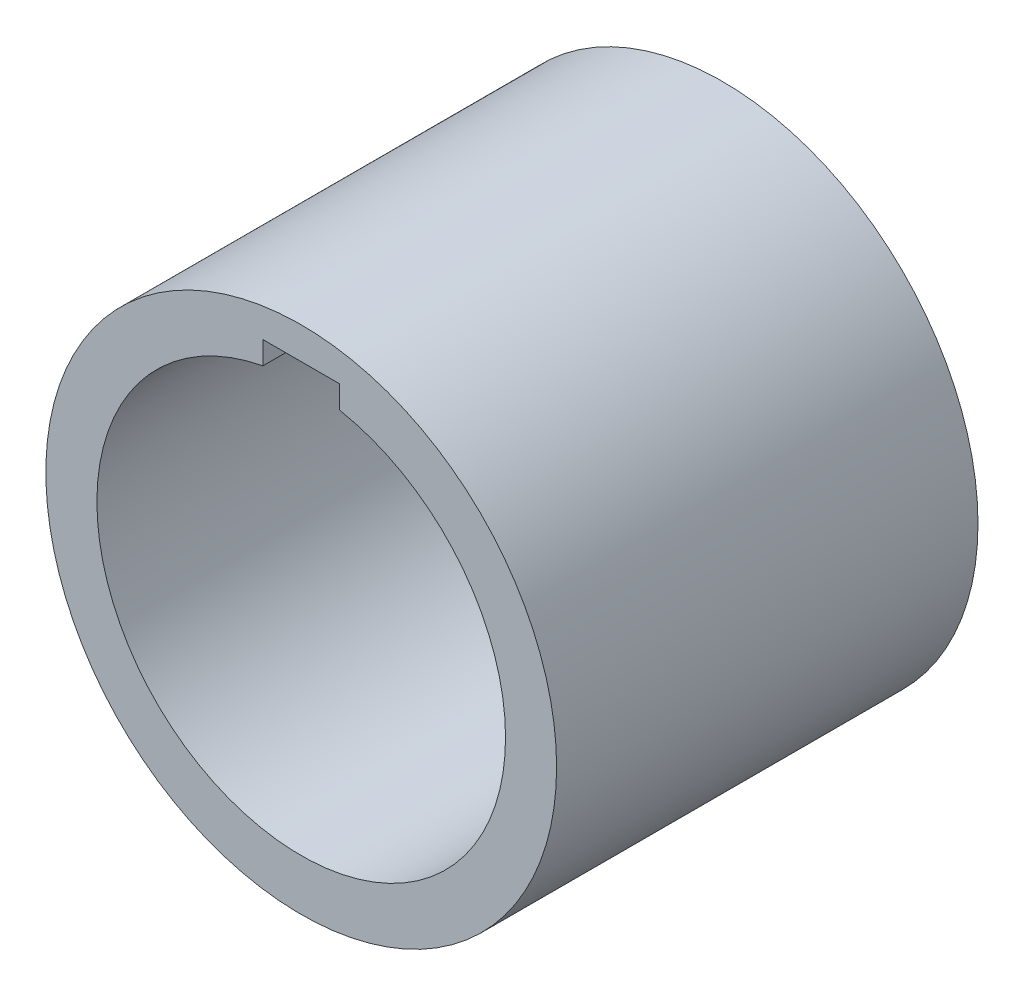
ISO-10303-21;
HEADER;
FILE_DESCRIPTION(('STEP AP214'),'2;1');
FILE_NAME('part.step','',(''),(''),'','','');
FILE_SCHEMA(('AUTOMOTIVE_DESIGN { 1 0 10303 214 1 1 1 1 }'));
ENDSEC;
DATA;
#1=APPLICATION_CONTEXT('core data for automotive mechanical design processes');
#2=APPLICATION_PROTOCOL_DEFINITION('international standard','automotive_design',2000,#1);
#3=PRODUCT_CONTEXT('',#1,'mechanical');
#4=PRODUCT('Part','Part','',(#3));
#5=PRODUCT_RELATED_PRODUCT_CATEGORY('part','',(#4));
#6=PRODUCT_DEFINITION_FORMATION('','',#4);
#7=PRODUCT_DEFINITION_CONTEXT('part definition',#1,'design');
#8=PRODUCT_DEFINITION('design','',#6,#7);
#9=PRODUCT_DEFINITION_SHAPE('','',#8);
#10=(LENGTH_UNIT() NAMED_UNIT(*) SI_UNIT(.MILLI.,.METRE.));
#11=(NAMED_UNIT(*) PLANE_ANGLE_UNIT() SI_UNIT($,.RADIAN.));
#12=(NAMED_UNIT(*) SI_UNIT($,.STERADIAN.) SOLID_ANGLE_UNIT());
#13=UNCERTAINTY_MEASURE_WITH_UNIT(LENGTH_MEASURE(1.E-05),#10,'distance_accuracy_value','');
#14=(GEOMETRIC_REPRESENTATION_CONTEXT(3) GLOBAL_UNCERTAINTY_ASSIGNED_CONTEXT((#13)) GLOBAL_UNIT_ASSIGNED_CONTEXT((#10,
#11,#12)) REPRESENTATION_CONTEXT('',''));
#15=CARTESIAN_POINT('',(0.,0.,0.));
#16=DIRECTION('',(0.,0.,1.));
#17=DIRECTION('',(1.,0.,0.));
#18=AXIS2_PLACEMENT_3D('',#15,#16,#17);
#19=CARTESIAN_POINT('',(0.,0.,1.5));
#20=DIRECTION('',(0.,0.,1.));
#21=DIRECTION('',(1.,0.,0.));
#22=AXIS2_PLACEMENT_3D('',#19,#20,#21);
#23=PLANE('',#22);
#24=CARTESIAN_POINT('',(-0.0916137197441338,5.9993005364254,1.5));
#25=DIRECTION('',(0.,0.,1.));
#26=DIRECTION('',(1.,0.,0.));
#27=AXIS2_PLACEMENT_3D('',#24,#25,#26);
#28=CIRCLE('',#27,0.949999999999778);
#29=CARTESIAN_POINT('',(0.858386280255644,5.9993005364254,1.5));
#30=VERTEX_POINT('',#29);
#31=EDGE_CURVE('E118',#30,#30,#28,.T.);
#32=ORIENTED_EDGE('',*,*,#31,.F.);
#33=EDGE_LOOP('',(#32));
#34=FACE_BOUND('',#33,.T.);
#35=CARTESIAN_POINT('',(-0.0916137197441338,5.9993005364254,1.5));
#36=DIRECTION('',(0.,0.,1.));
#37=DIRECTION('',(1.,0.,0.));
#38=AXIS2_PLACEMENT_3D('',#35,#36,#37);
#39=CIRCLE('',#38,1.44999999999978);
#40=CARTESIAN_POINT('',(1.35838628025564,5.9993005364254,1.5));
#41=VERTEX_POINT('',#40);
#42=EDGE_CURVE('E53',#41,#41,#39,.F.);
#43=ORIENTED_EDGE('',*,*,#42,.F.);
#44=EDGE_LOOP('',(#43));
#45=FACE_BOUND('',#44,.T.);
#46=ADVANCED_FACE('F45',(#34,#45),#23,.T.);
#47=CARTESIAN_POINT('',(5.99930053642566,0.0916137197443108,1.5));
#48=DIRECTION('',(0.,0.,1.));
#49=DIRECTION('',(1.,0.,0.));
#50=AXIS2_PLACEMENT_3D('',#47,#48,#49);
#51=CIRCLE('',#50,0.949999999999778);
#52=CARTESIAN_POINT('',(6.94930053642544,0.0916137197443108,1.5));
#53=VERTEX_POINT('',#52);
#54=EDGE_CURVE('E124',#53,#53,#51,.T.);
#55=ORIENTED_EDGE('',*,*,#54,.F.);
#56=EDGE_LOOP('',(#55));
#57=FACE_BOUND('',#56,.T.);
#58=CARTESIAN_POINT('',(5.99930053642566,0.0916137197443108,1.5));
#59=DIRECTION('',(0.,0.,1.));
#60=DIRECTION('',(1.,0.,0.));
#61=AXIS2_PLACEMENT_3D('',#58,#59,#60);
#62=CIRCLE('',#61,1.44999999999978);
#63=CARTESIAN_POINT('',(7.44930053642544,0.0916137197443108,1.5));
#64=VERTEX_POINT('',#63);
#65=EDGE_CURVE('E147',#64,#64,#62,.F.);
#66=ORIENTED_EDGE('',*,*,#65,.F.);
#67=EDGE_LOOP('',(#66));
#68=FACE_BOUND('',#67,.T.);
#69=ADVANCED_FACE('F155',(#57,#68),#23,.T.);
#70=CARTESIAN_POINT('',(-5.99930053642522,-0.091613719744401,1.5));
#71=DIRECTION('',(0.,0.,1.));
#72=DIRECTION('',(1.,0.,0.));
#73=AXIS2_PLACEMENT_3D('',#70,#71,#72);
#74=CIRCLE('',#73,0.949999999999778);
#75=CARTESIAN_POINT('',(-5.04930053642544,-0.091613719744401,1.5));
#76=VERTEX_POINT('',#75);
#77=EDGE_CURVE('E114',#76,#76,#74,.T.);
#78=ORIENTED_EDGE('',*,*,#77,.F.);
#79=EDGE_LOOP('',(#78));
#80=FACE_BOUND('',#79,.T.);
#81=CARTESIAN_POINT('',(-5.99930053642522,-0.091613719744401,1.5));
#82=DIRECTION('',(0.,0.,1.));
#83=DIRECTION('',(1.,0.,0.));
#84=AXIS2_PLACEMENT_3D('',#81,#82,#83);
#85=CIRCLE('',#84,1.44999999999978);
#86=CARTESIAN_POINT('',(-4.54930053642544,-0.091613719744401,1.5));
#87=VERTEX_POINT('',#86);
#88=EDGE_CURVE('E144',#87,#87,#85,.F.);
#89=ORIENTED_EDGE('',*,*,#88,.F.);
#90=EDGE_LOOP('',(#89));
#91=FACE_BOUND('',#90,.T.);
#92=ADVANCED_FACE('F163',(#80,#91),#23,.T.);
#93=CARTESIAN_POINT('',(0.0916137197445779,-5.99930053642549,1.5));
#94=DIRECTION('',(0.,0.,1.));
#95=DIRECTION('',(1.,0.,0.));
#96=AXIS2_PLACEMENT_3D('',#93,#94,#95);
#97=CIRCLE('',#96,0.949999999999778);
#98=CARTESIAN_POINT('',(1.04161371974436,-5.99930053642549,1.5));
#99=VERTEX_POINT('',#98);
#100=EDGE_CURVE('E108',#99,#99,#97,.T.);
#101=ORIENTED_EDGE('',*,*,#100,.F.);
#102=EDGE_LOOP('',(#101));
#103=FACE_BOUND('',#102,.T.);
#104=CARTESIAN_POINT('',(0.0916137197445779,-5.99930053642549,1.5));
#105=DIRECTION('',(0.,0.,1.));
#106=DIRECTION('',(1.,0.,0.));
#107=AXIS2_PLACEMENT_3D('',#104,#105,#106);
#108=CIRCLE('',#107,1.44999999999978);
#109=CARTESIAN_POINT('',(1.54161371974436,-5.99930053642549,1.5));
#110=VERTEX_POINT('',#109);
#111=EDGE_CURVE('E141',#110,#110,#108,.F.);
#112=ORIENTED_EDGE('',*,*,#111,.F.);
#113=EDGE_LOOP('',(#112));
#114=FACE_BOUND('',#113,.T.);
#115=ADVANCED_FACE('F170',(#103,#114),#23,.T.);
#116=CARTESIAN_POINT('',(0.,0.,1.5));
#117=DIRECTION('',(0.,0.,-1.));
#118=DIRECTION('',(-1.,0.,0.));
#119=AXIS2_PLACEMENT_3D('',#116,#117,#118);
#120=CYLINDRICAL_SURFACE('',#119,10.);
#121=CARTESIAN_POINT('',(0.,0.,0.));
#122=DIRECTION('',(0.,0.,1.));
#123=DIRECTION('',(1.,0.,0.));
#124=AXIS2_PLACEMENT_3D('',#121,#122,#123);
#125=CIRCLE('',#124,10.);
#126=CARTESIAN_POINT('',(10.,0.,0.));
#127=VERTEX_POINT('',#126);
#128=EDGE_CURVE('E138',#127,#127,#125,.T.);
#129=ORIENTED_EDGE('',*,*,#128,.T.);
#130=EDGE_LOOP('',(#129));
#131=FACE_BOUND('',#130,.T.);
#132=CARTESIAN_POINT('',(0.,0.,16.5));
#133=DIRECTION('',(0.,0.,1.));
#134=DIRECTION('',(1.,0.,0.));
#135=AXIS2_PLACEMENT_3D('',#132,#133,#134);
#136=CIRCLE('',#135,10.);
#137=CARTESIAN_POINT('',(10.,0.,16.5));
#138=VERTEX_POINT('',#137);
#139=EDGE_CURVE('E135',#138,#138,#136,.T.);
#140=ORIENTED_EDGE('',*,*,#139,.F.);
#141=EDGE_LOOP('',(#140));
#142=FACE_BOUND('',#141,.T.);
#143=ADVANCED_FACE('F47',(#131,#142),#120,.T.);
#144=CARTESIAN_POINT('',(0.,0.,0.));
#145=DIRECTION('',(0.,0.,1.));
#146=DIRECTION('',(1.,0.,0.));
#147=AXIS2_PLACEMENT_3D('',#144,#145,#146);
#148=PLANE('',#147);
#149=CARTESIAN_POINT('',(-5.99930053642522,-0.091613719744401,0.));
#150=DIRECTION('',(0.,0.,1.));
#151=DIRECTION('',(1.,0.,0.));
#152=AXIS2_PLACEMENT_3D('',#149,#150,#151);
#153=CIRCLE('',#152,0.949999999999778);
#154=CARTESIAN_POINT('',(-5.04930053642544,-0.091613719744401,0.));
#155=VERTEX_POINT('',#154);
#156=EDGE_CURVE('E117',#155,#155,#153,.F.);
#157=ORIENTED_EDGE('',*,*,#156,.F.);
#158=EDGE_LOOP('',(#157));
#159=FACE_BOUND('',#158,.T.);
#160=CARTESIAN_POINT('',(-0.0916137197441338,5.9993005364254,0.));
#161=DIRECTION('',(0.,0.,1.));
#162=DIRECTION('',(1.,0.,0.));
#163=AXIS2_PLACEMENT_3D('',#160,#161,#162);
#164=CIRCLE('',#163,0.949999999999778);
#165=CARTESIAN_POINT('',(0.858386280255644,5.9993005364254,0.));
#166=VERTEX_POINT('',#165);
#167=EDGE_CURVE('E121',#166,#166,#164,.F.);
#168=ORIENTED_EDGE('',*,*,#167,.F.);
#169=EDGE_LOOP('',(#168));
#170=FACE_BOUND('',#169,.T.);
#171=CARTESIAN_POINT('',(5.99930053642566,0.0916137197443108,0.));
#172=DIRECTION('',(0.,0.,1.));
#173=DIRECTION('',(1.,0.,0.));
#174=AXIS2_PLACEMENT_3D('',#171,#172,#173);
#175=CIRCLE('',#174,0.949999999999778);
#176=CARTESIAN_POINT('',(6.94930053642544,0.0916137197443108,0.));
#177=VERTEX_POINT('',#176);
#178=EDGE_CURVE('E127',#177,#177,#175,.F.);
#179=ORIENTED_EDGE('',*,*,#178,.F.);
#180=EDGE_LOOP('',(#179));
#181=FACE_BOUND('',#180,.T.);
#182=CARTESIAN_POINT('',(0.0916137197445779,-5.99930053642549,0.));
#183=DIRECTION('',(0.,0.,1.));
#184=DIRECTION('',(1.,0.,0.));
#185=AXIS2_PLACEMENT_3D('',#182,#183,#184);
#186=CIRCLE('',#185,0.949999999999778);
#187=CARTESIAN_POINT('',(1.04161371974436,-5.99930053642549,0.));
#188=VERTEX_POINT('',#187);
#189=EDGE_CURVE('E104',#188,#188,#186,.F.);
#190=ORIENTED_EDGE('',*,*,#189,.F.);
#191=EDGE_LOOP('',(#190));
#192=FACE_BOUND('',#191,.T.);
#193=ORIENTED_EDGE('',*,*,#128,.F.);
#194=EDGE_LOOP('',(#193));
#195=FACE_BOUND('',#194,.T.);
#196=ADVANCED_FACE('F185',(#159,#170,#181,#192,#195),#148,.F.);
#197=CARTESIAN_POINT('',(0.,0.,16.5));
#198=DIRECTION('',(0.,0.,1.));
#199=DIRECTION('',(1.,0.,0.));
#200=AXIS2_PLACEMENT_3D('',#197,#198,#199);
#201=PLANE('',#200);
#202=DIRECTION('',(0.,1.,0.));
#203=VECTOR('',#202,1.);
#204=CARTESIAN_POINT('',(1.5,7.25,16.5));
#205=LINE('',#204,#203);
#206=CARTESIAN_POINT('',(1.5,7.85811682275086,16.5));
#207=VERTEX_POINT('',#206);
#208=CARTESIAN_POINT('',(1.5,8.75,16.5));
#209=VERTEX_POINT('',#208);
#210=EDGE_CURVE('E273',#207,#209,#205,.T.);
#211=ORIENTED_EDGE('',*,*,#210,.F.);
#212=CARTESIAN_POINT('',(0.,0.,16.5));
#213=DIRECTION('',(0.,0.,1.));
#214=DIRECTION('',(1.,0.,0.));
#215=AXIS2_PLACEMENT_3D('',#212,#213,#214);
#216=CIRCLE('',#215,8.);
#217=CARTESIAN_POINT('',(-1.5,7.85811682275086,16.5));
#218=VERTEX_POINT('',#217);
#219=EDGE_CURVE('E103',#218,#207,#216,.T.);
#220=ORIENTED_EDGE('',*,*,#219,.F.);
#221=DIRECTION('',(0.,-1.,0.));
#222=VECTOR('',#221,1.);
#223=CARTESIAN_POINT('',(-1.5,7.25,16.5));
#224=LINE('',#223,#222);
#225=CARTESIAN_POINT('',(-1.5,8.75,16.5));
#226=VERTEX_POINT('',#225);
#227=EDGE_CURVE('E278',#226,#218,#224,.T.);
#228=ORIENTED_EDGE('',*,*,#227,.F.);
#229=DIRECTION('',(-1.,0.,0.));
#230=VECTOR('',#229,1.);
#231=CARTESIAN_POINT('',(-1.5,8.75,16.5));
#232=LINE('',#231,#230);
#233=EDGE_CURVE('E275',#209,#226,#232,.T.);
#234=ORIENTED_EDGE('',*,*,#233,.F.);
#235=EDGE_LOOP('',(#211,#220,#228,#234));
#236=FACE_BOUND('',#235,.T.);
#237=ORIENTED_EDGE('',*,*,#139,.T.);
#238=EDGE_LOOP('',(#237));
#239=FACE_BOUND('',#238,.T.);
#240=ADVANCED_FACE('F202',(#236,#239),#201,.T.);
#241=CARTESIAN_POINT('',(0.,0.,16.5));
#242=DIRECTION('',(0.,0.,-1.));
#243=DIRECTION('',(-1.,0.,0.));
#244=AXIS2_PLACEMENT_3D('',#241,#242,#243);
#245=CYLINDRICAL_SURFACE('',#244,8.);
#246=CARTESIAN_POINT('',(0.,0.,3.5));
#247=DIRECTION('',(0.,0.,1.));
#248=DIRECTION('',(1.,0.,0.));
#249=AXIS2_PLACEMENT_3D('',#246,#247,#248);
#250=CIRCLE('',#249,8.);
#251=CARTESIAN_POINT('',(-1.5,7.85811682275086,3.5));
#252=VERTEX_POINT('',#251);
#253=CARTESIAN_POINT('',(1.5,7.85811682275086,3.5));
#254=VERTEX_POINT('',#253);
#255=EDGE_CURVE('E85',#252,#254,#250,.T.);
#256=ORIENTED_EDGE('',*,*,#255,.F.);
#257=DIRECTION('',(0.,0.,-1.));
#258=VECTOR('',#257,1.);
#259=CARTESIAN_POINT('',(-1.5,7.85811682275086,16.5));
#260=LINE('',#259,#258);
#261=EDGE_CURVE('E105',#218,#252,#260,.T.);
#262=ORIENTED_EDGE('',*,*,#261,.F.);
#263=ORIENTED_EDGE('',*,*,#219,.T.);
#264=DIRECTION('',(0.,0.,-1.));
#265=VECTOR('',#264,1.);
#266=CARTESIAN_POINT('',(1.5,7.85811682275086,16.5));
#267=LINE('',#266,#265);
#268=EDGE_CURVE('E67',#254,#207,#267,.F.);
#269=ORIENTED_EDGE('',*,*,#268,.F.);
#270=EDGE_LOOP('',(#256,#262,#263,#269));
#271=FACE_BOUND('',#270,.T.);
#272=ADVANCED_FACE('F101',(#271),#245,.F.);
#273=CARTESIAN_POINT('',(0.0916137197445779,-5.99930053642549,-0.000999999999999916));
#274=DIRECTION('',(0.,0.,1.));
#275=DIRECTION('',(1.,0.,0.));
#276=AXIS2_PLACEMENT_3D('',#273,#274,#275);
#277=CYLINDRICAL_SURFACE('',#276,0.949999999999778);
#278=ORIENTED_EDGE('',*,*,#100,.T.);
#279=EDGE_LOOP('',(#278));
#280=FACE_BOUND('',#279,.T.);
#281=ORIENTED_EDGE('',*,*,#189,.T.);
#282=EDGE_LOOP('',(#281));
#283=FACE_BOUND('',#282,.T.);
#284=ADVANCED_FACE('F193',(#280,#283),#277,.F.);
#285=CARTESIAN_POINT('',(5.99930053642566,0.0916137197443108,-0.000999999999999916));
#286=DIRECTION('',(0.,0.,1.));
#287=DIRECTION('',(1.,0.,0.));
#288=AXIS2_PLACEMENT_3D('',#285,#286,#287);
#289=CYLINDRICAL_SURFACE('',#288,0.949999999999778);
#290=ORIENTED_EDGE('',*,*,#54,.T.);
#291=EDGE_LOOP('',(#290));
#292=FACE_BOUND('',#291,.T.);
#293=ORIENTED_EDGE('',*,*,#178,.T.);
#294=EDGE_LOOP('',(#293));
#295=FACE_BOUND('',#294,.T.);
#296=ADVANCED_FACE('F196',(#292,#295),#289,.F.);
#297=CARTESIAN_POINT('',(-0.0916137197441338,5.9993005364254,-0.000999999999999916));
#298=DIRECTION('',(0.,0.,1.));
#299=DIRECTION('',(1.,0.,0.));
#300=AXIS2_PLACEMENT_3D('',#297,#298,#299);
#301=CYLINDRICAL_SURFACE('',#300,0.949999999999778);
#302=ORIENTED_EDGE('',*,*,#31,.T.);
#303=EDGE_LOOP('',(#302));
#304=FACE_BOUND('',#303,.T.);
#305=ORIENTED_EDGE('',*,*,#167,.T.);
#306=EDGE_LOOP('',(#305));
#307=FACE_BOUND('',#306,.T.);
#308=ADVANCED_FACE('F216',(#304,#307),#301,.F.);
#309=CARTESIAN_POINT('',(-5.99930053642522,-0.091613719744401,-0.000999999999999916));
#310=DIRECTION('',(0.,0.,1.));
#311=DIRECTION('',(1.,0.,0.));
#312=AXIS2_PLACEMENT_3D('',#309,#310,#311);
#313=CYLINDRICAL_SURFACE('',#312,0.949999999999778);
#314=ORIENTED_EDGE('',*,*,#77,.T.);
#315=EDGE_LOOP('',(#314));
#316=FACE_BOUND('',#315,.T.);
#317=ORIENTED_EDGE('',*,*,#156,.T.);
#318=EDGE_LOOP('',(#317));
#319=FACE_BOUND('',#318,.T.);
#320=ADVANCED_FACE('F220',(#316,#319),#313,.F.);
#321=CARTESIAN_POINT('',(1.5,7.25,-1.85410196624968));
#322=DIRECTION('',(1.,0.,0.));
#323=DIRECTION('',(0.,0.,-1.));
#324=AXIS2_PLACEMENT_3D('',#321,#322,#323);
#325=PLANE('',#324);
#326=DIRECTION('',(0.,0.,1.));
#327=VECTOR('',#326,1.);
#328=CARTESIAN_POINT('',(1.5,8.75,-1.85410196624968));
#329=LINE('',#328,#327);
#330=CARTESIAN_POINT('',(1.5,8.75,3.5));
#331=VERTEX_POINT('',#330);
#332=EDGE_CURVE('E97',#331,#209,#329,.T.);
#333=ORIENTED_EDGE('',*,*,#332,.F.);
#334=DIRECTION('',(0.,1.,0.));
#335=VECTOR('',#334,1.);
#336=CARTESIAN_POINT('',(1.5,7.85811682275086,3.5));
#337=LINE('',#336,#335);
#338=EDGE_CURVE('E60',#254,#331,#337,.T.);
#339=ORIENTED_EDGE('',*,*,#338,.F.);
#340=ORIENTED_EDGE('',*,*,#268,.T.);
#341=ORIENTED_EDGE('',*,*,#210,.T.);
#342=EDGE_LOOP('',(#333,#339,#340,#341));
#343=FACE_BOUND('',#342,.T.);
#344=ADVANCED_FACE('F96',(#343),#325,.F.);
#345=CARTESIAN_POINT('',(-1.5,7.25,-1.85410196624968));
#346=DIRECTION('',(-1.,0.,0.));
#347=DIRECTION('',(0.,-1.,0.));
#348=AXIS2_PLACEMENT_3D('',#345,#346,#347);
#349=PLANE('',#348);
#350=ORIENTED_EDGE('',*,*,#261,.T.);
#351=DIRECTION('',(0.,-1.,0.));
#352=VECTOR('',#351,1.);
#353=CARTESIAN_POINT('',(-1.5,8.75,3.5));
#354=LINE('',#353,#352);
#355=CARTESIAN_POINT('',(-1.5,8.75,3.5));
#356=VERTEX_POINT('',#355);
#357=EDGE_CURVE('E89',#356,#252,#354,.T.);
#358=ORIENTED_EDGE('',*,*,#357,.F.);
#359=DIRECTION('',(0.,0.,1.));
#360=VECTOR('',#359,1.);
#361=CARTESIAN_POINT('',(-1.5,8.75,-1.85410196624968));
#362=LINE('',#361,#360);
#363=EDGE_CURVE('E110',#356,#226,#362,.T.);
#364=ORIENTED_EDGE('',*,*,#363,.T.);
#365=ORIENTED_EDGE('',*,*,#227,.T.);
#366=EDGE_LOOP('',(#350,#358,#364,#365));
#367=FACE_BOUND('',#366,.T.);
#368=ADVANCED_FACE('F226',(#367),#349,.F.);
#369=CARTESIAN_POINT('',(-1.5,8.75,-1.85410196624968));
#370=DIRECTION('',(0.,1.,0.));
#371=DIRECTION('',(0.,0.,1.));
#372=AXIS2_PLACEMENT_3D('',#369,#370,#371);
#373=PLANE('',#372);
#374=ORIENTED_EDGE('',*,*,#363,.F.);
#375=DIRECTION('',(-1.,0.,0.));
#376=VECTOR('',#375,1.);
#377=CARTESIAN_POINT('',(1.5,8.75,3.5));
#378=LINE('',#377,#376);
#379=EDGE_CURVE('E98',#331,#356,#378,.T.);
#380=ORIENTED_EDGE('',*,*,#379,.F.);
#381=ORIENTED_EDGE('',*,*,#332,.T.);
#382=ORIENTED_EDGE('',*,*,#233,.T.);
#383=EDGE_LOOP('',(#374,#380,#381,#382));
#384=FACE_BOUND('',#383,.T.);
#385=ADVANCED_FACE('F227',(#384),#373,.F.);
#386=CARTESIAN_POINT('',(0.,0.,3.5));
#387=DIRECTION('',(0.,0.,1.));
#388=DIRECTION('',(1.,0.,0.));
#389=AXIS2_PLACEMENT_3D('',#386,#387,#388);
#390=PLANE('',#389);
#391=CARTESIAN_POINT('',(-5.99930053642522,-0.091613719744401,3.5));
#392=DIRECTION('',(0.,0.,1.));
#393=DIRECTION('',(1.,0.,0.));
#394=AXIS2_PLACEMENT_3D('',#391,#392,#393);
#395=CIRCLE('',#394,1.44999999999978);
#396=CARTESIAN_POINT('',(-4.54930053642544,-0.091613719744401,3.5));
#397=VERTEX_POINT('',#396);
#398=EDGE_CURVE('E255',#397,#397,#395,.T.);
#399=ORIENTED_EDGE('',*,*,#398,.F.);
#400=EDGE_LOOP('',(#399));
#401=FACE_BOUND('',#400,.T.);
#402=CARTESIAN_POINT('',(-0.0916137197441338,5.9993005364254,3.5));
#403=DIRECTION('',(0.,0.,1.));
#404=DIRECTION('',(1.,0.,0.));
#405=AXIS2_PLACEMENT_3D('',#402,#403,#404);
#406=CIRCLE('',#405,1.44999999999978);
#407=CARTESIAN_POINT('',(1.35838628025564,5.9993005364254,3.5));
#408=VERTEX_POINT('',#407);
#409=EDGE_CURVE('E262',#408,#408,#406,.T.);
#410=ORIENTED_EDGE('',*,*,#409,.F.);
#411=EDGE_LOOP('',(#410));
#412=FACE_BOUND('',#411,.T.);
#413=ORIENTED_EDGE('',*,*,#255,.T.);
#414=ORIENTED_EDGE('',*,*,#338,.T.);
#415=ORIENTED_EDGE('',*,*,#379,.T.);
#416=ORIENTED_EDGE('',*,*,#357,.T.);
#417=EDGE_LOOP('',(#413,#414,#415,#416));
#418=FACE_BOUND('',#417,.T.);
#419=CARTESIAN_POINT('',(0.,0.,3.5));
#420=DIRECTION('',(0.,0.,1.));
#421=DIRECTION('',(1.,0.,0.));
#422=AXIS2_PLACEMENT_3D('',#419,#420,#421);
#423=CIRCLE('',#422,3.);
#424=CARTESIAN_POINT('',(3.,0.,3.5));
#425=VERTEX_POINT('',#424);
#426=EDGE_CURVE('E93',#425,#425,#423,.T.);
#427=ORIENTED_EDGE('',*,*,#426,.F.);
#428=EDGE_LOOP('',(#427));
#429=FACE_BOUND('',#428,.T.);
#430=CARTESIAN_POINT('',(5.99930053642566,0.0916137197443108,3.5));
#431=DIRECTION('',(0.,0.,1.));
#432=DIRECTION('',(1.,0.,0.));
#433=AXIS2_PLACEMENT_3D('',#430,#431,#432);
#434=CIRCLE('',#433,1.44999999999978);
#435=CARTESIAN_POINT('',(7.44930053642544,0.0916137197443108,3.5));
#436=VERTEX_POINT('',#435);
#437=EDGE_CURVE('E258',#436,#436,#434,.T.);
#438=ORIENTED_EDGE('',*,*,#437,.F.);
#439=EDGE_LOOP('',(#438));
#440=FACE_BOUND('',#439,.T.);
#441=CARTESIAN_POINT('',(0.0916137197445779,-5.99930053642549,3.5));
#442=DIRECTION('',(0.,0.,1.));
#443=DIRECTION('',(1.,0.,0.));
#444=AXIS2_PLACEMENT_3D('',#441,#442,#443);
#445=CIRCLE('',#444,1.44999999999978);
#446=CARTESIAN_POINT('',(1.54161371974436,-5.99930053642549,3.5));
#447=VERTEX_POINT('',#446);
#448=EDGE_CURVE('E259',#447,#447,#445,.T.);
#449=ORIENTED_EDGE('',*,*,#448,.F.);
#450=EDGE_LOOP('',(#449));
#451=FACE_BOUND('',#450,.T.);
#452=ADVANCED_FACE('F86',(#401,#412,#418,#429,#440,#451),#390,.T.);
#453=CARTESIAN_POINT('',(0.,0.,3.5));
#454=DIRECTION('',(0.,0.,-1.));
#455=DIRECTION('',(-1.,0.,0.));
#456=AXIS2_PLACEMENT_3D('',#453,#454,#455);
#457=CYLINDRICAL_SURFACE('',#456,3.);
#458=ORIENTED_EDGE('',*,*,#426,.T.);
#459=EDGE_LOOP('',(#458));
#460=FACE_BOUND('',#459,.T.);
#461=CARTESIAN_POINT('',(0.,0.,1.5));
#462=DIRECTION('',(0.,0.,1.));
#463=DIRECTION('',(1.,0.,0.));
#464=AXIS2_PLACEMENT_3D('',#461,#462,#463);
#465=CIRCLE('',#464,3.);
#466=CARTESIAN_POINT('',(3.,0.,1.5));
#467=VERTEX_POINT('',#466);
#468=EDGE_CURVE('E11',#467,#467,#465,.F.);
#469=ORIENTED_EDGE('',*,*,#468,.T.);
#470=EDGE_LOOP('',(#469));
#471=FACE_BOUND('',#470,.T.);
#472=ADVANCED_FACE('F236',(#460,#471),#457,.F.);
#473=CARTESIAN_POINT('',(-0.0916137197441338,5.9993005364254,3.5));
#474=DIRECTION('',(0.,0.,-1.));
#475=DIRECTION('',(-1.,0.,0.));
#476=AXIS2_PLACEMENT_3D('',#473,#474,#475);
#477=CYLINDRICAL_SURFACE('',#476,1.44999999999978);
#478=ORIENTED_EDGE('',*,*,#409,.T.);
#479=EDGE_LOOP('',(#478));
#480=FACE_BOUND('',#479,.T.);
#481=ORIENTED_EDGE('',*,*,#42,.T.);
#482=EDGE_LOOP('',(#481));
#483=FACE_BOUND('',#482,.T.);
#484=ADVANCED_FACE('F152',(#480,#483),#477,.F.);
#485=CARTESIAN_POINT('',(5.99930053642566,0.0916137197443108,3.5));
#486=DIRECTION('',(0.,0.,-1.));
#487=DIRECTION('',(-1.,0.,0.));
#488=AXIS2_PLACEMENT_3D('',#485,#486,#487);
#489=CYLINDRICAL_SURFACE('',#488,1.44999999999978);
#490=ORIENTED_EDGE('',*,*,#437,.T.);
#491=EDGE_LOOP('',(#490));
#492=FACE_BOUND('',#491,.T.);
#493=ORIENTED_EDGE('',*,*,#65,.T.);
#494=EDGE_LOOP('',(#493));
#495=FACE_BOUND('',#494,.T.);
#496=ADVANCED_FACE('F243',(#492,#495),#489,.F.);
#497=CARTESIAN_POINT('',(-5.99930053642522,-0.091613719744401,3.5));
#498=DIRECTION('',(0.,0.,-1.));
#499=DIRECTION('',(-1.,0.,0.));
#500=AXIS2_PLACEMENT_3D('',#497,#498,#499);
#501=CYLINDRICAL_SURFACE('',#500,1.44999999999978);
#502=ORIENTED_EDGE('',*,*,#398,.T.);
#503=EDGE_LOOP('',(#502));
#504=FACE_BOUND('',#503,.T.);
#505=ORIENTED_EDGE('',*,*,#88,.T.);
#506=EDGE_LOOP('',(#505));
#507=FACE_BOUND('',#506,.T.);
#508=ADVANCED_FACE('F174',(#504,#507),#501,.F.);
#509=CARTESIAN_POINT('',(0.0916137197445779,-5.99930053642549,3.5));
#510=DIRECTION('',(0.,0.,-1.));
#511=DIRECTION('',(-1.,0.,0.));
#512=AXIS2_PLACEMENT_3D('',#509,#510,#511);
#513=CYLINDRICAL_SURFACE('',#512,1.44999999999978);
#514=ORIENTED_EDGE('',*,*,#448,.T.);
#515=EDGE_LOOP('',(#514));
#516=FACE_BOUND('',#515,.T.);
#517=ORIENTED_EDGE('',*,*,#111,.T.);
#518=EDGE_LOOP('',(#517));
#519=FACE_BOUND('',#518,.T.);
#520=ADVANCED_FACE('F168',(#516,#519),#513,.F.);
#521=ORIENTED_EDGE('',*,*,#468,.F.);
#522=EDGE_LOOP('',(#521));
#523=FACE_BOUND('',#522,.T.);
#524=ADVANCED_FACE('F158',(#523),#23,.T.);
#525=CLOSED_SHELL('',(#46,#69,#92,#115,#143,#196,#240,#272,#284,#296,#308,#320,#344,#368,#385,
#452,#472,#484,#496,#508,#520,#524));
#526=MANIFOLD_SOLID_BREP('B2',#525);
#527=ADVANCED_BREP_SHAPE_REPRESENTATION('',(#18,#526),#14);
#528=SHAPE_DEFINITION_REPRESENTATION(#9,#527);
ENDSEC;
END-ISO-10303-21;
